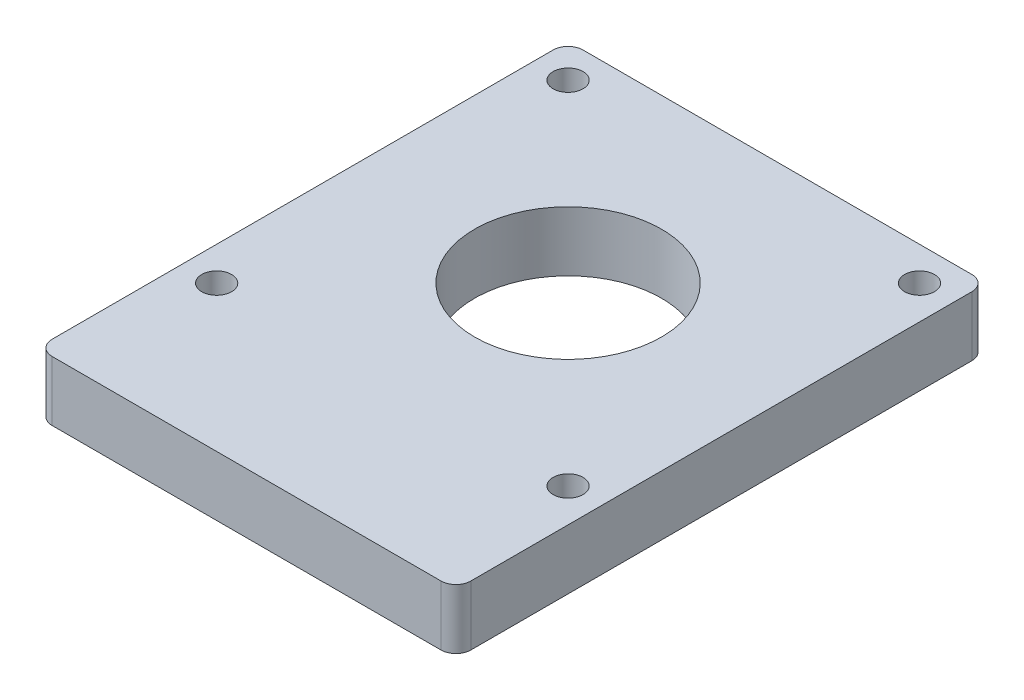
ISO-10303-21;
HEADER;
FILE_DESCRIPTION(('STEP AP214'),'2;1');
FILE_NAME('part.step','',(''),(''),'','','');
FILE_SCHEMA(('AUTOMOTIVE_DESIGN { 1 0 10303 214 1 1 1 1 }'));
ENDSEC;
DATA;
#1=APPLICATION_CONTEXT('core data for automotive mechanical design processes');
#2=APPLICATION_PROTOCOL_DEFINITION('international standard','automotive_design',2000,#1);
#3=PRODUCT_CONTEXT('',#1,'mechanical');
#4=PRODUCT('Part','Part','',(#3));
#5=PRODUCT_RELATED_PRODUCT_CATEGORY('part','',(#4));
#6=PRODUCT_DEFINITION_FORMATION('','',#4);
#7=PRODUCT_DEFINITION_CONTEXT('part definition',#1,'design');
#8=PRODUCT_DEFINITION('design','',#6,#7);
#9=PRODUCT_DEFINITION_SHAPE('','',#8);
#10=(LENGTH_UNIT() NAMED_UNIT(*) SI_UNIT(.MILLI.,.METRE.));
#11=(NAMED_UNIT(*) PLANE_ANGLE_UNIT() SI_UNIT($,.RADIAN.));
#12=(NAMED_UNIT(*) SI_UNIT($,.STERADIAN.) SOLID_ANGLE_UNIT());
#13=UNCERTAINTY_MEASURE_WITH_UNIT(LENGTH_MEASURE(1.E-05),#10,'distance_accuracy_value','');
#14=(GEOMETRIC_REPRESENTATION_CONTEXT(3) GLOBAL_UNCERTAINTY_ASSIGNED_CONTEXT((#13)) GLOBAL_UNIT_ASSIGNED_CONTEXT((#10,
#11,#12)) REPRESENTATION_CONTEXT('',''));
#15=CARTESIAN_POINT('',(0.,0.,0.));
#16=DIRECTION('',(0.,0.,1.));
#17=DIRECTION('',(1.,0.,0.));
#18=AXIS2_PLACEMENT_3D('',#15,#16,#17);
#19=CARTESIAN_POINT('',(0.,8.,0.));
#20=DIRECTION('',(1.,0.,0.));
#21=DIRECTION('',(0.,0.,-1.));
#22=AXIS2_PLACEMENT_3D('',#19,#20,#21);
#23=PLANE('',#22);
#24=DIRECTION('',(0.,0.,1.));
#25=VECTOR('',#24,1.);
#26=CARTESIAN_POINT('',(0.,8.,0.));
#27=LINE('',#26,#25);
#28=CARTESIAN_POINT('',(0.,8.,-69.));
#29=VERTEX_POINT('',#28);
#30=CARTESIAN_POINT('',(0.,8.,-2.));
#31=VERTEX_POINT('',#30);
#32=EDGE_CURVE('E118',#29,#31,#27,.T.);
#33=ORIENTED_EDGE('',*,*,#32,.F.);
#34=DIRECTION('',(0.,-1.,0.));
#35=VECTOR('',#34,1.);
#36=CARTESIAN_POINT('',(0.,8.,-69.));
#37=LINE('',#36,#35);
#38=CARTESIAN_POINT('',(0.,0.,-69.));
#39=VERTEX_POINT('',#38);
#40=EDGE_CURVE('E103',#29,#39,#37,.T.);
#41=ORIENTED_EDGE('',*,*,#40,.T.);
#42=DIRECTION('',(0.,0.,1.));
#43=VECTOR('',#42,1.);
#44=CARTESIAN_POINT('',(0.,0.,0.));
#45=LINE('',#44,#43);
#46=CARTESIAN_POINT('',(0.,0.,-2.));
#47=VERTEX_POINT('',#46);
#48=EDGE_CURVE('E115',#39,#47,#45,.T.);
#49=ORIENTED_EDGE('',*,*,#48,.T.);
#50=DIRECTION('',(0.,-1.,0.));
#51=VECTOR('',#50,1.);
#52=CARTESIAN_POINT('',(0.,8.,-2.));
#53=LINE('',#52,#51);
#54=EDGE_CURVE('E120',#47,#31,#53,.F.);
#55=ORIENTED_EDGE('',*,*,#54,.T.);
#56=EDGE_LOOP('',(#33,#41,#49,#55));
#57=FACE_BOUND('',#56,.T.);
#58=ADVANCED_FACE('F33',(#57),#23,.F.);
#59=CARTESIAN_POINT('',(0.,8.,0.));
#60=DIRECTION('',(0.,0.,-1.));
#61=DIRECTION('',(-1.,0.,0.));
#62=AXIS2_PLACEMENT_3D('',#59,#60,#61);
#63=PLANE('',#62);
#64=DIRECTION('',(1.,0.,0.));
#65=VECTOR('',#64,1.);
#66=CARTESIAN_POINT('',(0.,0.,0.));
#67=LINE('',#66,#65);
#68=CARTESIAN_POINT('',(2.,0.,0.));
#69=VERTEX_POINT('',#68);
#70=CARTESIAN_POINT('',(54.,0.,0.));
#71=VERTEX_POINT('',#70);
#72=EDGE_CURVE('E124',#69,#71,#67,.T.);
#73=ORIENTED_EDGE('',*,*,#72,.T.);
#74=DIRECTION('',(0.,-1.,0.));
#75=VECTOR('',#74,1.);
#76=CARTESIAN_POINT('',(54.,8.,0.));
#77=LINE('',#76,#75);
#78=CARTESIAN_POINT('',(54.,8.,0.));
#79=VERTEX_POINT('',#78);
#80=EDGE_CURVE('E11',#71,#79,#77,.F.);
#81=ORIENTED_EDGE('',*,*,#80,.T.);
#82=DIRECTION('',(1.,0.,0.));
#83=VECTOR('',#82,1.);
#84=CARTESIAN_POINT('',(0.,8.,0.));
#85=LINE('',#84,#83);
#86=CARTESIAN_POINT('',(2.,8.,0.));
#87=VERTEX_POINT('',#86);
#88=EDGE_CURVE('E164',#87,#79,#85,.T.);
#89=ORIENTED_EDGE('',*,*,#88,.F.);
#90=DIRECTION('',(0.,-1.,0.));
#91=VECTOR('',#90,1.);
#92=CARTESIAN_POINT('',(2.,8.,0.));
#93=LINE('',#92,#91);
#94=EDGE_CURVE('E41',#87,#69,#93,.T.);
#95=ORIENTED_EDGE('',*,*,#94,.T.);
#96=EDGE_LOOP('',(#73,#81,#89,#95));
#97=FACE_BOUND('',#96,.T.);
#98=ADVANCED_FACE('F162',(#97),#63,.F.);
#99=CARTESIAN_POINT('',(56.,8.,0.));
#100=DIRECTION('',(-1.,0.,0.));
#101=DIRECTION('',(0.,0.,1.));
#102=AXIS2_PLACEMENT_3D('',#99,#100,#101);
#103=PLANE('',#102);
#104=DIRECTION('',(0.,0.,-1.));
#105=VECTOR('',#104,1.);
#106=CARTESIAN_POINT('',(56.,0.,0.));
#107=LINE('',#106,#105);
#108=CARTESIAN_POINT('',(56.,0.,-2.));
#109=VERTEX_POINT('',#108);
#110=CARTESIAN_POINT('',(56.,0.,-69.));
#111=VERTEX_POINT('',#110);
#112=EDGE_CURVE('E128',#109,#111,#107,.T.);
#113=ORIENTED_EDGE('',*,*,#112,.T.);
#114=DIRECTION('',(0.,-1.,0.));
#115=VECTOR('',#114,1.);
#116=CARTESIAN_POINT('',(56.,8.,-69.));
#117=LINE('',#116,#115);
#118=CARTESIAN_POINT('',(56.,8.,-69.));
#119=VERTEX_POINT('',#118);
#120=EDGE_CURVE('E48',#111,#119,#117,.F.);
#121=ORIENTED_EDGE('',*,*,#120,.T.);
#122=DIRECTION('',(0.,0.,-1.));
#123=VECTOR('',#122,1.);
#124=CARTESIAN_POINT('',(56.,8.,0.));
#125=LINE('',#124,#123);
#126=CARTESIAN_POINT('',(56.,8.,-2.));
#127=VERTEX_POINT('',#126);
#128=EDGE_CURVE('E172',#127,#119,#125,.T.);
#129=ORIENTED_EDGE('',*,*,#128,.F.);
#130=DIRECTION('',(0.,-1.,0.));
#131=VECTOR('',#130,1.);
#132=CARTESIAN_POINT('',(56.,8.,-2.));
#133=LINE('',#132,#131);
#134=EDGE_CURVE('E155',#127,#109,#133,.T.);
#135=ORIENTED_EDGE('',*,*,#134,.T.);
#136=EDGE_LOOP('',(#113,#121,#129,#135));
#137=FACE_BOUND('',#136,.T.);
#138=ADVANCED_FACE('F171',(#137),#103,.F.);
#139=CARTESIAN_POINT('',(0.,8.,-71.));
#140=DIRECTION('',(0.,0.,1.));
#141=DIRECTION('',(1.,0.,0.));
#142=AXIS2_PLACEMENT_3D('',#139,#140,#141);
#143=PLANE('',#142);
#144=DIRECTION('',(-1.,0.,0.));
#145=VECTOR('',#144,1.);
#146=CARTESIAN_POINT('',(0.,0.,-71.));
#147=LINE('',#146,#145);
#148=CARTESIAN_POINT('',(54.,0.,-71.));
#149=VERTEX_POINT('',#148);
#150=CARTESIAN_POINT('',(2.,0.,-71.));
#151=VERTEX_POINT('',#150);
#152=EDGE_CURVE('E138',#149,#151,#147,.T.);
#153=ORIENTED_EDGE('',*,*,#152,.T.);
#154=DIRECTION('',(0.,-1.,0.));
#155=VECTOR('',#154,1.);
#156=CARTESIAN_POINT('',(2.,8.,-71.));
#157=LINE('',#156,#155);
#158=CARTESIAN_POINT('',(2.,8.,-71.));
#159=VERTEX_POINT('',#158);
#160=EDGE_CURVE('E104',#151,#159,#157,.F.);
#161=ORIENTED_EDGE('',*,*,#160,.T.);
#162=DIRECTION('',(-1.,0.,0.));
#163=VECTOR('',#162,1.);
#164=CARTESIAN_POINT('',(0.,8.,-71.));
#165=LINE('',#164,#163);
#166=CARTESIAN_POINT('',(54.,8.,-71.));
#167=VERTEX_POINT('',#166);
#168=EDGE_CURVE('E134',#167,#159,#165,.T.);
#169=ORIENTED_EDGE('',*,*,#168,.F.);
#170=DIRECTION('',(0.,-1.,0.));
#171=VECTOR('',#170,1.);
#172=CARTESIAN_POINT('',(54.,8.,-71.));
#173=LINE('',#172,#171);
#174=EDGE_CURVE('E109',#167,#149,#173,.T.);
#175=ORIENTED_EDGE('',*,*,#174,.T.);
#176=EDGE_LOOP('',(#153,#161,#169,#175));
#177=FACE_BOUND('',#176,.T.);
#178=ADVANCED_FACE('F217',(#177),#143,.F.);
#179=CARTESIAN_POINT('',(0.,8.,0.));
#180=DIRECTION('',(0.,-1.,0.));
#181=DIRECTION('',(0.,0.,-1.));
#182=AXIS2_PLACEMENT_3D('',#179,#180,#181);
#183=PLANE('',#182);
#184=CARTESIAN_POINT('',(28.,8.,-43.));
#185=DIRECTION('',(0.,1.,0.));
#186=DIRECTION('',(0.,0.,1.));
#187=AXIS2_PLACEMENT_3D('',#184,#185,#186);
#188=CIRCLE('',#187,12.5);
#189=CARTESIAN_POINT('',(28.,8.,-30.5));
#190=VERTEX_POINT('',#189);
#191=EDGE_CURVE('E199',#190,#190,#188,.T.);
#192=ORIENTED_EDGE('',*,*,#191,.F.);
#193=EDGE_LOOP('',(#192));
#194=FACE_BOUND('',#193,.T.);
#195=CARTESIAN_POINT('',(4.5,8.,-19.5));
#196=DIRECTION('',(0.,1.,0.));
#197=DIRECTION('',(0.,0.,1.));
#198=AXIS2_PLACEMENT_3D('',#195,#196,#197);
#199=CIRCLE('',#198,2.);
#200=CARTESIAN_POINT('',(4.5,8.,-17.5));
#201=VERTEX_POINT('',#200);
#202=EDGE_CURVE('E193',#201,#201,#199,.T.);
#203=ORIENTED_EDGE('',*,*,#202,.F.);
#204=EDGE_LOOP('',(#203));
#205=FACE_BOUND('',#204,.T.);
#206=CARTESIAN_POINT('',(51.5,8.,-19.5));
#207=DIRECTION('',(0.,1.,0.));
#208=DIRECTION('',(0.,0.,1.));
#209=AXIS2_PLACEMENT_3D('',#206,#207,#208);
#210=CIRCLE('',#209,2.);
#211=CARTESIAN_POINT('',(51.5,8.,-17.5));
#212=VERTEX_POINT('',#211);
#213=EDGE_CURVE('E187',#212,#212,#210,.T.);
#214=ORIENTED_EDGE('',*,*,#213,.F.);
#215=EDGE_LOOP('',(#214));
#216=FACE_BOUND('',#215,.T.);
#217=CARTESIAN_POINT('',(51.5,8.,-66.5));
#218=DIRECTION('',(0.,1.,0.));
#219=DIRECTION('',(0.,0.,1.));
#220=AXIS2_PLACEMENT_3D('',#217,#218,#219);
#221=CIRCLE('',#220,2.);
#222=CARTESIAN_POINT('',(51.5,8.,-64.5));
#223=VERTEX_POINT('',#222);
#224=EDGE_CURVE('E181',#223,#223,#221,.T.);
#225=ORIENTED_EDGE('',*,*,#224,.F.);
#226=EDGE_LOOP('',(#225));
#227=FACE_BOUND('',#226,.T.);
#228=CARTESIAN_POINT('',(4.5,8.,-66.5));
#229=DIRECTION('',(0.,1.,0.));
#230=DIRECTION('',(0.,0.,1.));
#231=AXIS2_PLACEMENT_3D('',#228,#229,#230);
#232=CIRCLE('',#231,2.);
#233=CARTESIAN_POINT('',(4.5,8.,-64.5));
#234=VERTEX_POINT('',#233);
#235=EDGE_CURVE('E131',#234,#234,#232,.T.);
#236=ORIENTED_EDGE('',*,*,#235,.F.);
#237=EDGE_LOOP('',(#236));
#238=FACE_BOUND('',#237,.T.);
#239=ORIENTED_EDGE('',*,*,#168,.T.);
#240=CARTESIAN_POINT('',(2.,8.,-69.));
#241=DIRECTION('',(0.,-1.,0.));
#242=DIRECTION('',(0.,0.,-1.));
#243=AXIS2_PLACEMENT_3D('',#240,#241,#242);
#244=CIRCLE('',#243,2.);
#245=EDGE_CURVE('E153',#159,#29,#244,.F.);
#246=ORIENTED_EDGE('',*,*,#245,.T.);
#247=ORIENTED_EDGE('',*,*,#32,.T.);
#248=CARTESIAN_POINT('',(2.,8.,-2.));
#249=DIRECTION('',(0.,-1.,0.));
#250=DIRECTION('',(0.,0.,-1.));
#251=AXIS2_PLACEMENT_3D('',#248,#249,#250);
#252=CIRCLE('',#251,2.);
#253=EDGE_CURVE('E148',#31,#87,#252,.F.);
#254=ORIENTED_EDGE('',*,*,#253,.T.);
#255=ORIENTED_EDGE('',*,*,#88,.T.);
#256=CARTESIAN_POINT('',(54.,8.,-2.));
#257=DIRECTION('',(0.,-1.,0.));
#258=DIRECTION('',(0.,0.,-1.));
#259=AXIS2_PLACEMENT_3D('',#256,#257,#258);
#260=CIRCLE('',#259,2.);
#261=EDGE_CURVE('E55',#79,#127,#260,.F.);
#262=ORIENTED_EDGE('',*,*,#261,.T.);
#263=ORIENTED_EDGE('',*,*,#128,.T.);
#264=CARTESIAN_POINT('',(54.,8.,-69.));
#265=DIRECTION('',(0.,-1.,0.));
#266=DIRECTION('',(0.,0.,-1.));
#267=AXIS2_PLACEMENT_3D('',#264,#265,#266);
#268=CIRCLE('',#267,2.);
#269=EDGE_CURVE('E151',#119,#167,#268,.F.);
#270=ORIENTED_EDGE('',*,*,#269,.T.);
#271=EDGE_LOOP('',(#239,#246,#247,#254,#255,#262,#263,#270));
#272=FACE_BOUND('',#271,.T.);
#273=ADVANCED_FACE('F214',(#194,#205,#216,#227,#238,#272),#183,.F.);
#274=CARTESIAN_POINT('',(0.,0.,0.));
#275=DIRECTION('',(0.,-1.,0.));
#276=DIRECTION('',(0.,0.,-1.));
#277=AXIS2_PLACEMENT_3D('',#274,#275,#276);
#278=PLANE('',#277);
#279=CARTESIAN_POINT('',(28.,0.,-43.));
#280=DIRECTION('',(0.,1.,0.));
#281=DIRECTION('',(0.,0.,1.));
#282=AXIS2_PLACEMENT_3D('',#279,#280,#281);
#283=CIRCLE('',#282,12.5);
#284=CARTESIAN_POINT('',(28.,0.,-30.5));
#285=VERTEX_POINT('',#284);
#286=EDGE_CURVE('E196',#285,#285,#283,.T.);
#287=ORIENTED_EDGE('',*,*,#286,.T.);
#288=EDGE_LOOP('',(#287));
#289=FACE_BOUND('',#288,.T.);
#290=CARTESIAN_POINT('',(4.5,0.,-19.5));
#291=DIRECTION('',(0.,1.,0.));
#292=DIRECTION('',(0.,0.,1.));
#293=AXIS2_PLACEMENT_3D('',#290,#291,#292);
#294=CIRCLE('',#293,2.);
#295=CARTESIAN_POINT('',(4.5,0.,-17.5));
#296=VERTEX_POINT('',#295);
#297=EDGE_CURVE('E190',#296,#296,#294,.T.);
#298=ORIENTED_EDGE('',*,*,#297,.T.);
#299=EDGE_LOOP('',(#298));
#300=FACE_BOUND('',#299,.T.);
#301=CARTESIAN_POINT('',(51.5,0.,-19.5));
#302=DIRECTION('',(0.,1.,0.));
#303=DIRECTION('',(0.,0.,1.));
#304=AXIS2_PLACEMENT_3D('',#301,#302,#303);
#305=CIRCLE('',#304,2.);
#306=CARTESIAN_POINT('',(51.5,0.,-17.5));
#307=VERTEX_POINT('',#306);
#308=EDGE_CURVE('E184',#307,#307,#305,.T.);
#309=ORIENTED_EDGE('',*,*,#308,.T.);
#310=EDGE_LOOP('',(#309));
#311=FACE_BOUND('',#310,.T.);
#312=CARTESIAN_POINT('',(51.5,0.,-66.5));
#313=DIRECTION('',(0.,1.,0.));
#314=DIRECTION('',(0.,0.,1.));
#315=AXIS2_PLACEMENT_3D('',#312,#313,#314);
#316=CIRCLE('',#315,2.);
#317=CARTESIAN_POINT('',(51.5,0.,-64.5));
#318=VERTEX_POINT('',#317);
#319=EDGE_CURVE('E179',#318,#318,#316,.T.);
#320=ORIENTED_EDGE('',*,*,#319,.T.);
#321=EDGE_LOOP('',(#320));
#322=FACE_BOUND('',#321,.T.);
#323=CARTESIAN_POINT('',(4.5,0.,-66.5));
#324=DIRECTION('',(0.,1.,0.));
#325=DIRECTION('',(0.,0.,1.));
#326=AXIS2_PLACEMENT_3D('',#323,#324,#325);
#327=CIRCLE('',#326,2.);
#328=CARTESIAN_POINT('',(4.5,0.,-64.5));
#329=VERTEX_POINT('',#328);
#330=EDGE_CURVE('E125',#329,#329,#327,.T.);
#331=ORIENTED_EDGE('',*,*,#330,.T.);
#332=EDGE_LOOP('',(#331));
#333=FACE_BOUND('',#332,.T.);
#334=ORIENTED_EDGE('',*,*,#48,.F.);
#335=CARTESIAN_POINT('',(2.,0.,-69.));
#336=DIRECTION('',(0.,-1.,0.));
#337=DIRECTION('',(0.,0.,-1.));
#338=AXIS2_PLACEMENT_3D('',#335,#336,#337);
#339=CIRCLE('',#338,2.);
#340=EDGE_CURVE('E99',#39,#151,#339,.T.);
#341=ORIENTED_EDGE('',*,*,#340,.T.);
#342=ORIENTED_EDGE('',*,*,#152,.F.);
#343=CARTESIAN_POINT('',(54.,0.,-69.));
#344=DIRECTION('',(0.,-1.,0.));
#345=DIRECTION('',(0.,0.,-1.));
#346=AXIS2_PLACEMENT_3D('',#343,#344,#345);
#347=CIRCLE('',#346,2.);
#348=EDGE_CURVE('E110',#149,#111,#347,.T.);
#349=ORIENTED_EDGE('',*,*,#348,.T.);
#350=ORIENTED_EDGE('',*,*,#112,.F.);
#351=CARTESIAN_POINT('',(54.,0.,-2.));
#352=DIRECTION('',(0.,-1.,0.));
#353=DIRECTION('',(0.,0.,-1.));
#354=AXIS2_PLACEMENT_3D('',#351,#352,#353);
#355=CIRCLE('',#354,2.);
#356=EDGE_CURVE('E142',#109,#71,#355,.T.);
#357=ORIENTED_EDGE('',*,*,#356,.T.);
#358=ORIENTED_EDGE('',*,*,#72,.F.);
#359=CARTESIAN_POINT('',(2.,0.,-2.));
#360=DIRECTION('',(0.,-1.,0.));
#361=DIRECTION('',(0.,0.,-1.));
#362=AXIS2_PLACEMENT_3D('',#359,#360,#361);
#363=CIRCLE('',#362,2.);
#364=EDGE_CURVE('E119',#69,#47,#363,.T.);
#365=ORIENTED_EDGE('',*,*,#364,.T.);
#366=EDGE_LOOP('',(#334,#341,#342,#349,#350,#357,#358,#365));
#367=FACE_BOUND('',#366,.T.);
#368=ADVANCED_FACE('F122',(#289,#300,#311,#322,#333,#367),#278,.T.);
#369=CARTESIAN_POINT('',(2.,8.,-69.));
#370=DIRECTION('',(0.,-1.,0.));
#371=DIRECTION('',(0.,0.,-1.));
#372=AXIS2_PLACEMENT_3D('',#369,#370,#371);
#373=CYLINDRICAL_SURFACE('',#372,2.);
#374=ORIENTED_EDGE('',*,*,#245,.F.);
#375=ORIENTED_EDGE('',*,*,#160,.F.);
#376=ORIENTED_EDGE('',*,*,#340,.F.);
#377=ORIENTED_EDGE('',*,*,#40,.F.);
#378=EDGE_LOOP('',(#374,#375,#376,#377));
#379=FACE_BOUND('',#378,.T.);
#380=ADVANCED_FACE('F102',(#379),#373,.T.);
#381=CARTESIAN_POINT('',(54.,8.,-69.));
#382=DIRECTION('',(0.,-1.,0.));
#383=DIRECTION('',(0.,0.,-1.));
#384=AXIS2_PLACEMENT_3D('',#381,#382,#383);
#385=CYLINDRICAL_SURFACE('',#384,2.);
#386=ORIENTED_EDGE('',*,*,#269,.F.);
#387=ORIENTED_EDGE('',*,*,#120,.F.);
#388=ORIENTED_EDGE('',*,*,#348,.F.);
#389=ORIENTED_EDGE('',*,*,#174,.F.);
#390=EDGE_LOOP('',(#386,#387,#388,#389));
#391=FACE_BOUND('',#390,.T.);
#392=ADVANCED_FACE('F230',(#391),#385,.T.);
#393=CARTESIAN_POINT('',(54.,8.,-2.));
#394=DIRECTION('',(0.,-1.,0.));
#395=DIRECTION('',(0.,0.,-1.));
#396=AXIS2_PLACEMENT_3D('',#393,#394,#395);
#397=CYLINDRICAL_SURFACE('',#396,2.);
#398=ORIENTED_EDGE('',*,*,#261,.F.);
#399=ORIENTED_EDGE('',*,*,#80,.F.);
#400=ORIENTED_EDGE('',*,*,#356,.F.);
#401=ORIENTED_EDGE('',*,*,#134,.F.);
#402=EDGE_LOOP('',(#398,#399,#400,#401));
#403=FACE_BOUND('',#402,.T.);
#404=ADVANCED_FACE('F170',(#403),#397,.T.);
#405=CARTESIAN_POINT('',(2.,8.,-2.));
#406=DIRECTION('',(0.,-1.,0.));
#407=DIRECTION('',(0.,0.,-1.));
#408=AXIS2_PLACEMENT_3D('',#405,#406,#407);
#409=CYLINDRICAL_SURFACE('',#408,2.);
#410=ORIENTED_EDGE('',*,*,#253,.F.);
#411=ORIENTED_EDGE('',*,*,#54,.F.);
#412=ORIENTED_EDGE('',*,*,#364,.F.);
#413=ORIENTED_EDGE('',*,*,#94,.F.);
#414=EDGE_LOOP('',(#410,#411,#412,#413));
#415=FACE_BOUND('',#414,.T.);
#416=ADVANCED_FACE('F35',(#415),#409,.T.);
#417=CARTESIAN_POINT('',(4.5,0.,-66.5));
#418=DIRECTION('',(0.,1.,0.));
#419=DIRECTION('',(0.,0.,1.));
#420=AXIS2_PLACEMENT_3D('',#417,#418,#419);
#421=CYLINDRICAL_SURFACE('',#420,2.);
#422=ORIENTED_EDGE('',*,*,#330,.F.);
#423=EDGE_LOOP('',(#422));
#424=FACE_BOUND('',#423,.T.);
#425=ORIENTED_EDGE('',*,*,#235,.T.);
#426=EDGE_LOOP('',(#425));
#427=FACE_BOUND('',#426,.T.);
#428=ADVANCED_FACE('F251',(#424,#427),#421,.F.);
#429=CARTESIAN_POINT('',(51.5,0.,-66.5));
#430=DIRECTION('',(0.,1.,0.));
#431=DIRECTION('',(0.,0.,1.));
#432=AXIS2_PLACEMENT_3D('',#429,#430,#431);
#433=CYLINDRICAL_SURFACE('',#432,2.);
#434=ORIENTED_EDGE('',*,*,#319,.F.);
#435=EDGE_LOOP('',(#434));
#436=FACE_BOUND('',#435,.T.);
#437=ORIENTED_EDGE('',*,*,#224,.T.);
#438=EDGE_LOOP('',(#437));
#439=FACE_BOUND('',#438,.T.);
#440=ADVANCED_FACE('F254',(#436,#439),#433,.F.);
#441=CARTESIAN_POINT('',(51.5,0.,-19.5));
#442=DIRECTION('',(0.,1.,0.));
#443=DIRECTION('',(0.,0.,1.));
#444=AXIS2_PLACEMENT_3D('',#441,#442,#443);
#445=CYLINDRICAL_SURFACE('',#444,2.);
#446=ORIENTED_EDGE('',*,*,#308,.F.);
#447=EDGE_LOOP('',(#446));
#448=FACE_BOUND('',#447,.T.);
#449=ORIENTED_EDGE('',*,*,#213,.T.);
#450=EDGE_LOOP('',(#449));
#451=FACE_BOUND('',#450,.T.);
#452=ADVANCED_FACE('F258',(#448,#451),#445,.F.);
#453=CARTESIAN_POINT('',(4.5,0.,-19.5));
#454=DIRECTION('',(0.,1.,0.));
#455=DIRECTION('',(0.,0.,1.));
#456=AXIS2_PLACEMENT_3D('',#453,#454,#455);
#457=CYLINDRICAL_SURFACE('',#456,2.);
#458=ORIENTED_EDGE('',*,*,#297,.F.);
#459=EDGE_LOOP('',(#458));
#460=FACE_BOUND('',#459,.T.);
#461=ORIENTED_EDGE('',*,*,#202,.T.);
#462=EDGE_LOOP('',(#461));
#463=FACE_BOUND('',#462,.T.);
#464=ADVANCED_FACE('F210',(#460,#463),#457,.F.);
#465=CARTESIAN_POINT('',(28.,0.,-43.));
#466=DIRECTION('',(0.,1.,0.));
#467=DIRECTION('',(0.,0.,1.));
#468=AXIS2_PLACEMENT_3D('',#465,#466,#467);
#469=CYLINDRICAL_SURFACE('',#468,12.5);
#470=ORIENTED_EDGE('',*,*,#286,.F.);
#471=EDGE_LOOP('',(#470));
#472=FACE_BOUND('',#471,.T.);
#473=ORIENTED_EDGE('',*,*,#191,.T.);
#474=EDGE_LOOP('',(#473));
#475=FACE_BOUND('',#474,.T.);
#476=ADVANCED_FACE('F207',(#472,#475),#469,.F.);
#477=CLOSED_SHELL('',(#58,#98,#138,#178,#273,#368,#380,#392,#404,#416,#428,#440,#452,#464,#476));
#478=MANIFOLD_SOLID_BREP('B2',#477);
#479=ADVANCED_BREP_SHAPE_REPRESENTATION('',(#18,#478),#14);
#480=SHAPE_DEFINITION_REPRESENTATION(#9,#479);
ENDSEC;
END-ISO-10303-21;
